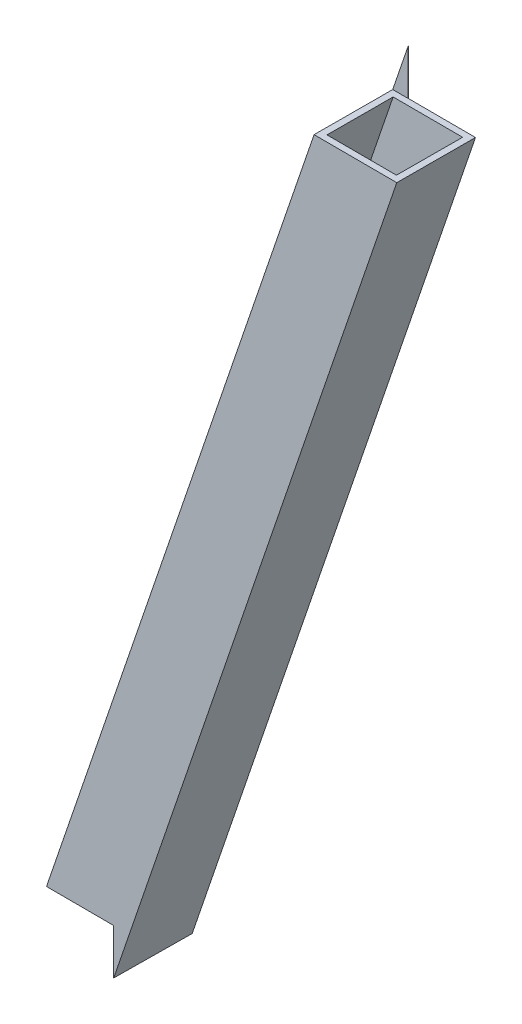
ISO-10303-21;
HEADER;
FILE_DESCRIPTION(('STEP AP214'),'2;1');
FILE_NAME('part.step','',(''),(''),'','','');
FILE_SCHEMA(('AUTOMOTIVE_DESIGN { 1 0 10303 214 1 1 1 1 }'));
ENDSEC;
DATA;
#1=APPLICATION_CONTEXT('core data for automotive mechanical design processes');
#2=APPLICATION_PROTOCOL_DEFINITION('international standard','automotive_design',2000,#1);
#3=PRODUCT_CONTEXT('',#1,'mechanical');
#4=PRODUCT('Part','Part','',(#3));
#5=PRODUCT_RELATED_PRODUCT_CATEGORY('part','',(#4));
#6=PRODUCT_DEFINITION_FORMATION('','',#4);
#7=PRODUCT_DEFINITION_CONTEXT('part definition',#1,'design');
#8=PRODUCT_DEFINITION('design','',#6,#7);
#9=PRODUCT_DEFINITION_SHAPE('','',#8);
#10=(LENGTH_UNIT() NAMED_UNIT(*) SI_UNIT(.MILLI.,.METRE.));
#11=(NAMED_UNIT(*) PLANE_ANGLE_UNIT() SI_UNIT($,.RADIAN.));
#12=(NAMED_UNIT(*) SI_UNIT($,.STERADIAN.) SOLID_ANGLE_UNIT());
#13=UNCERTAINTY_MEASURE_WITH_UNIT(LENGTH_MEASURE(1.E-05),#10,'distance_accuracy_value','');
#14=(GEOMETRIC_REPRESENTATION_CONTEXT(3) GLOBAL_UNCERTAINTY_ASSIGNED_CONTEXT((#13)) GLOBAL_UNIT_ASSIGNED_CONTEXT((#10,
#11,#12)) REPRESENTATION_CONTEXT('',''));
#15=CARTESIAN_POINT('',(0.,0.,0.));
#16=DIRECTION('',(0.,0.,1.));
#17=DIRECTION('',(1.,0.,0.));
#18=AXIS2_PLACEMENT_3D('',#15,#16,#17);
#19=CARTESIAN_POINT('',(259.494014953427,216.76340399315,-2309.96935937523));
#20=DIRECTION('',(-0.946505758584915,0.322672417699403,-0.00305938255490225));
#21=DIRECTION('',(-0.322673927788139,-0.94651018817854,0.));
#22=AXIS2_PLACEMENT_3D('',#19,#20,#21);
#23=PLANE('',#22);
#24=DIRECTION('',(0.,0.00948096236965107,0.999955054666231));
#25=VECTOR('',#24,1.);
#26=CARTESIAN_POINT('',(185.,-1.73273111590877,-2307.8977126295));
#27=LINE('',#26,#25);
#28=CARTESIAN_POINT('',(185.,-1.75237320356851,-2309.96935937523));
#29=VERTEX_POINT('',#28);
#30=CARTESIAN_POINT('',(185.,-1.5627463207353,-2289.96945297367));
#31=VERTEX_POINT('',#30);
#32=EDGE_CURVE('E51',#29,#31,#27,.T.);
#33=ORIENTED_EDGE('',*,*,#32,.F.);
#34=DIRECTION('',(-0.322673927788139,-0.94651018817854,0.));
#35=VECTOR('',#34,1.);
#36=CARTESIAN_POINT('',(259.494014953427,216.76340399315,-2309.96935937523));
#37=LINE('',#36,#35);
#38=CARTESIAN_POINT('',(257.188309046744,210.,-2309.96935937523));
#39=VERTEX_POINT('',#38);
#40=EDGE_CURVE('E186',#39,#29,#37,.T.);
#41=ORIENTED_EDGE('',*,*,#40,.F.);
#42=DIRECTION('',(0.00323227465391518,0.,-0.999994776186637));
#43=VECTOR('',#42,1.);
#44=CARTESIAN_POINT('',(257.188333135763,210.,-2309.97681201106));
#45=LINE('',#44,#43);
#46=CARTESIAN_POINT('',(257.123663518432,210.,-2289.96945297367));
#47=VERTEX_POINT('',#46);
#48=EDGE_CURVE('E183',#47,#39,#45,.T.);
#49=ORIENTED_EDGE('',*,*,#48,.F.);
#50=DIRECTION('',(-0.322673927788139,-0.94651018817854,0.));
#51=VECTOR('',#50,1.);
#52=CARTESIAN_POINT('',(259.436100218272,216.783147652862,-2289.96945297367));
#53=LINE('',#52,#51);
#54=EDGE_CURVE('E45',#47,#31,#53,.T.);
#55=ORIENTED_EDGE('',*,*,#54,.T.);
#56=EDGE_LOOP('',(#33,#41,#49,#55));
#57=FACE_BOUND('',#56,.T.);
#58=ADVANCED_FACE('F41',(#57),#23,.F.);
#59=CARTESIAN_POINT('',(259.436100218272,216.783147652862,-2289.96945297367));
#60=DIRECTION('',(0.00289573675774193,-0.000987182985593841,-0.999995320078241));
#61=DIRECTION('',(-0.99999580734144,0.,-0.00289573816873449));
#62=AXIS2_PLACEMENT_3D('',#59,#60,#61);
#63=PLANE('',#62);
#64=DIRECTION('',(0.,0.999999512730672,-0.000987187124528355));
#65=VECTOR('',#64,1.);
#66=CARTESIAN_POINT('',(185.,216.7829348664,-2290.18500112386));
#67=LINE('',#66,#65);
#68=CARTESIAN_POINT('',(185.,10.,-2289.98086757352));
#69=VERTEX_POINT('',#68);
#70=EDGE_CURVE('E11',#31,#69,#67,.T.);
#71=ORIENTED_EDGE('',*,*,#70,.F.);
#72=ORIENTED_EDGE('',*,*,#54,.F.);
#73=DIRECTION('',(0.99999580734144,0.,0.00289573816873449));
#74=VECTOR('',#73,1.);
#75=CARTESIAN_POINT('',(259.436080827797,210.,-2289.96275679053));
#76=LINE('',#75,#74);
#77=CARTESIAN_POINT('',(235.993509135147,210.,-2290.03064062477));
#78=VERTEX_POINT('',#77);
#79=EDGE_CURVE('E125',#78,#47,#76,.T.);
#80=ORIENTED_EDGE('',*,*,#79,.F.);
#81=DIRECTION('',(-0.322673927788139,-0.94651018817854,0.));
#82=VECTOR('',#81,1.);
#83=CARTESIAN_POINT('',(240.505985046573,223.23659600685,-2290.03064062477));
#84=LINE('',#83,#82);
#85=CARTESIAN_POINT('',(167.811690953239,10.,-2290.03064062477));
#86=VERTEX_POINT('',#85);
#87=EDGE_CURVE('E184',#78,#86,#84,.T.);
#88=ORIENTED_EDGE('',*,*,#87,.T.);
#89=DIRECTION('',(-0.99999580734144,0.,-0.00289573816873449));
#90=VECTOR('',#89,1.);
#91=CARTESIAN_POINT('',(259.435509102829,10.,-2289.76532092499));
#92=LINE('',#91,#90);
#93=EDGE_CURVE('E200',#69,#86,#92,.T.);
#94=ORIENTED_EDGE('',*,*,#93,.F.);
#95=EDGE_LOOP('',(#71,#72,#80,#88,#94));
#96=FACE_BOUND('',#95,.T.);
#97=ADVANCED_FACE('F220',(#96),#63,.F.);
#98=CARTESIAN_POINT('',(259.494014953427,216.76340399315,-2309.96935937523));
#99=DIRECTION('',(-0.00289573675774193,0.000987182985593842,0.99999532007824));
#100=DIRECTION('',(0.99999580734144,0.,0.00289573816873449));
#101=AXIS2_PLACEMENT_3D('',#98,#99,#100);
#102=PLANE('',#101);
#103=DIRECTION('',(0.,-0.999999512730672,0.000987187124528357));
#104=VECTOR('',#103,1.);
#105=CARTESIAN_POINT('',(185.,216.76319104113,-2310.18507523188));
#106=LINE('',#105,#104);
#107=CARTESIAN_POINT('',(185.,10.,-2309.9809611724));
#108=VERTEX_POINT('',#107);
#109=EDGE_CURVE('E82',#108,#29,#106,.T.);
#110=ORIENTED_EDGE('',*,*,#109,.F.);
#111=DIRECTION('',(0.99999580734144,0.,0.00289573816873449));
#112=VECTOR('',#111,1.);
#113=CARTESIAN_POINT('',(259.493423894423,10.,-2309.76524681709));
#114=LINE('',#113,#112);
#115=CARTESIAN_POINT('',(167.876336481568,10.,-2310.03054702633));
#116=VERTEX_POINT('',#115);
#117=EDGE_CURVE('E207',#116,#108,#114,.T.);
#118=ORIENTED_EDGE('',*,*,#117,.F.);
#119=DIRECTION('',(-0.322673927788139,-0.94651018817854,0.));
#120=VECTOR('',#119,1.);
#121=CARTESIAN_POINT('',(240.563899781728,223.216852347138,-2310.03054702633));
#122=LINE('',#121,#120);
#123=CARTESIAN_POINT('',(240.,221.562746320735,-2310.03054702633));
#124=VERTEX_POINT('',#123);
#125=EDGE_CURVE('E168',#124,#116,#122,.T.);
#126=ORIENTED_EDGE('',*,*,#125,.F.);
#127=DIRECTION('',(0.,0.999999512730672,-0.000987187124528357));
#128=VECTOR('',#127,1.);
#129=CARTESIAN_POINT('',(240.,216.763348266662,-2310.02580912006));
#130=LINE('',#129,#128);
#131=CARTESIAN_POINT('',(240.,210.,-2310.01913242648));
#132=VERTEX_POINT('',#131);
#133=EDGE_CURVE('E201',#132,#124,#130,.T.);
#134=ORIENTED_EDGE('',*,*,#133,.F.);
#135=DIRECTION('',(-0.99999580734144,0.,-0.00289573816873449));
#136=VECTOR('',#135,1.);
#137=CARTESIAN_POINT('',(259.493995619392,210.,-2309.96268268263));
#138=LINE('',#137,#136);
#139=EDGE_CURVE('E137',#39,#132,#138,.T.);
#140=ORIENTED_EDGE('',*,*,#139,.F.);
#141=ORIENTED_EDGE('',*,*,#40,.T.);
#142=EDGE_LOOP('',(#110,#118,#126,#134,#140,#141));
#143=FACE_BOUND('',#142,.T.);
#144=ADVANCED_FACE('F212',(#143),#102,.F.);
#145=CARTESIAN_POINT('',(257.974972560878,217.281259354246,-2308.3742618752));
#146=DIRECTION('',(-0.946505758584915,0.322672417699403,-0.0030593825549024));
#147=DIRECTION('',(-0.322673927788139,-0.94651018817854,0.));
#148=AXIS2_PLACEMENT_3D('',#145,#146,#147);
#149=PLANE('',#148);
#150=DIRECTION('',(-0.322673927788139,-0.94651018817854,0.));
#151=VECTOR('',#150,1.);
#152=CARTESIAN_POINT('',(257.974972560878,217.281259354246,-2308.3742618752));
#153=LINE('',#152,#151);
#154=CARTESIAN_POINT('',(255.492725053749,210.,-2308.3742618752));
#155=VERTEX_POINT('',#154);
#156=CARTESIAN_POINT('',(185.,3.22133984233567,-2308.3742618752));
#157=VERTEX_POINT('',#156);
#158=EDGE_CURVE('E194',#155,#157,#153,.T.);
#159=ORIENTED_EDGE('',*,*,#158,.T.);
#160=DIRECTION('',(0.,0.00948096236965153,0.999955054666231));
#161=VECTOR('',#160,1.);
#162=CARTESIAN_POINT('',(185.,3.24058139897487,-2306.34485904974));
#163=LINE('',#162,#161);
#164=CARTESIAN_POINT('',(185.,3.3806264239157,-2291.57434049788));
#165=VERTEX_POINT('',#164);
#166=EDGE_CURVE('E191',#157,#165,#163,.T.);
#167=ORIENTED_EDGE('',*,*,#166,.T.);
#168=DIRECTION('',(-0.322673927788139,-0.94651018817854,0.));
#169=VECTOR('',#168,1.);
#170=CARTESIAN_POINT('',(257.926324183348,217.297844028404,-2291.57434049788));
#171=LINE('',#170,#169);
#172=CARTESIAN_POINT('',(255.438422810031,210.,-2291.57434049788));
#173=VERTEX_POINT('',#172);
#174=EDGE_CURVE('E197',#173,#165,#171,.T.);
#175=ORIENTED_EDGE('',*,*,#174,.F.);
#176=DIRECTION('',(0.00323227465391534,0.,-0.999994776186637));
#177=VECTOR('',#176,1.);
#178=CARTESIAN_POINT('',(255.492750987277,210.,-2308.38228513899));
#179=LINE('',#178,#177);
#180=EDGE_CURVE('E154',#173,#155,#179,.T.);
#181=ORIENTED_EDGE('',*,*,#180,.T.);
#182=EDGE_LOOP('',(#159,#167,#175,#181));
#183=FACE_BOUND('',#182,.T.);
#184=ADVANCED_FACE('F227',(#183),#149,.T.);
#185=CARTESIAN_POINT('',(257.926324183348,217.297844028404,-2291.57434049788));
#186=DIRECTION('',(0.00289573675775995,-0.000987182985599982,-0.99999532007824));
#187=DIRECTION('',(-0.99999580734144,0.,-0.00289573816875251));
#188=AXIS2_PLACEMENT_3D('',#185,#186,#187);
#189=PLANE('',#188);
#190=ORIENTED_EDGE('',*,*,#174,.T.);
#191=DIRECTION('',(0.,0.999999512730672,-0.000987187124534497));
#192=VECTOR('',#191,1.);
#193=CARTESIAN_POINT('',(185.,217.297635557857,-2291.78551671792));
#194=LINE('',#193,#192);
#195=CARTESIAN_POINT('',(185.,10.,-2291.58087506143));
#196=VERTEX_POINT('',#195);
#197=EDGE_CURVE('E195',#165,#196,#194,.T.);
#198=ORIENTED_EDGE('',*,*,#197,.T.);
#199=DIRECTION('',(-0.99999580734144,0.,-0.00289573816875251));
#200=VECTOR('',#199,1.);
#201=CARTESIAN_POINT('',(257.925731596581,10.,-2291.36970035158));
#202=LINE('',#201,#200);
#203=CARTESIAN_POINT('',(169.507274946216,10.,-2291.6257381248));
#204=VERTEX_POINT('',#203);
#205=EDGE_CURVE('E160',#196,#204,#202,.T.);
#206=ORIENTED_EDGE('',*,*,#205,.T.);
#207=DIRECTION('',(-0.322673927788139,-0.94651018817854,0.));
#208=VECTOR('',#207,1.);
#209=CARTESIAN_POINT('',(242.025027439122,222.718740645754,-2291.6257381248));
#210=LINE('',#209,#208);
#211=CARTESIAN_POINT('',(237.689093128069,210.,-2291.6257381248));
#212=VERTEX_POINT('',#211);
#213=EDGE_CURVE('E165',#212,#204,#210,.T.);
#214=ORIENTED_EDGE('',*,*,#213,.F.);
#215=DIRECTION('',(0.99999580734144,0.,0.00289573816875251));
#216=VECTOR('',#215,1.);
#217=CARTESIAN_POINT('',(257.92630332155,210.,-2291.56713621712));
#218=LINE('',#217,#216);
#219=EDGE_CURVE('E148',#212,#173,#218,.T.);
#220=ORIENTED_EDGE('',*,*,#219,.T.);
#221=EDGE_LOOP('',(#190,#198,#206,#214,#220));
#222=FACE_BOUND('',#221,.T.);
#223=ADVANCED_FACE('F171',(#222),#189,.T.);
#224=CARTESIAN_POINT('',(257.974972560878,217.281259354246,-2308.3742618752));
#225=DIRECTION('',(-0.00289573675775995,0.000987182985599982,0.99999532007824));
#226=DIRECTION('',(0.99999580734144,0.,0.00289573816875251));
#227=AXIS2_PLACEMENT_3D('',#224,#225,#226);
#228=PLANE('',#227);
#229=DIRECTION('',(0.99999580734144,0.,0.00289573816875251));
#230=VECTOR('',#229,1.);
#231=CARTESIAN_POINT('',(257.974380021521,10.,-2308.16963810094));
#232=LINE('',#231,#230);
#233=CARTESIAN_POINT('',(169.561577189971,10.,-2308.42565950212));
#234=VERTEX_POINT('',#233);
#235=CARTESIAN_POINT('',(185.,10.,-2308.38095368449));
#236=VERTEX_POINT('',#235);
#237=EDGE_CURVE('E159',#234,#236,#232,.T.);
#238=ORIENTED_EDGE('',*,*,#237,.T.);
#239=DIRECTION('',(0.,-0.999999512730672,0.000987187124534497));
#240=VECTOR('',#239,1.);
#241=CARTESIAN_POINT('',(185.,217.28105074463,-2308.58557896865));
#242=LINE('',#241,#240);
#243=EDGE_CURVE('E187',#236,#157,#242,.T.);
#244=ORIENTED_EDGE('',*,*,#243,.T.);
#245=ORIENTED_EDGE('',*,*,#158,.F.);
#246=DIRECTION('',(-0.99999580734144,0.,-0.00289573816875251));
#247=VECTOR('',#246,1.);
#248=CARTESIAN_POINT('',(257.97495174649,210.,-2308.36707396648));
#249=LINE('',#248,#247);
#250=CARTESIAN_POINT('',(237.74339537179,210.,-2308.42565950212));
#251=VERTEX_POINT('',#250);
#252=EDGE_CURVE('E190',#155,#251,#249,.T.);
#253=ORIENTED_EDGE('',*,*,#252,.T.);
#254=DIRECTION('',(-0.322673927788139,-0.94651018817854,0.));
#255=VECTOR('',#254,1.);
#256=CARTESIAN_POINT('',(242.073675816652,222.702155971596,-2308.42565950212));
#257=LINE('',#256,#255);
#258=EDGE_CURVE('E167',#251,#234,#257,.T.);
#259=ORIENTED_EDGE('',*,*,#258,.T.);
#260=EDGE_LOOP('',(#238,#244,#245,#253,#259));
#261=FACE_BOUND('',#260,.T.);
#262=ADVANCED_FACE('F231',(#261),#228,.T.);
#263=CARTESIAN_POINT('',(250.,210.,-2310.));
#264=DIRECTION('',(0.,1.,0.));
#265=DIRECTION('',(0.,0.,1.));
#266=AXIS2_PLACEMENT_3D('',#263,#264,#265);
#267=PLANE('',#266);
#268=ORIENTED_EDGE('',*,*,#139,.T.);
#269=DIRECTION('',(0.,0.,-1.));
#270=VECTOR('',#269,1.);
#271=CARTESIAN_POINT('',(240.,210.,-2000.));
#272=LINE('',#271,#270);
#273=CARTESIAN_POINT('',(240.,210.,-2310.));
#274=VERTEX_POINT('',#273);
#275=EDGE_CURVE('E134',#274,#132,#272,.T.);
#276=ORIENTED_EDGE('',*,*,#275,.F.);
#277=DIRECTION('',(-1.,0.,0.));
#278=VECTOR('',#277,1.);
#279=CARTESIAN_POINT('',(250.,210.,-2310.));
#280=LINE('',#279,#278);
#281=CARTESIAN_POINT('',(236.058055926491,210.,-2310.));
#282=VERTEX_POINT('',#281);
#283=EDGE_CURVE('E249',#274,#282,#280,.T.);
#284=ORIENTED_EDGE('',*,*,#283,.T.);
#285=DIRECTION('',(-0.00323227465391656,0.,0.999994776186637));
#286=VECTOR('',#285,1.);
#287=CARTESIAN_POINT('',(236.058201737606,210.,-2310.045110756));
#288=LINE('',#287,#286);
#289=EDGE_CURVE('E130',#282,#78,#288,.T.);
#290=ORIENTED_EDGE('',*,*,#289,.T.);
#291=ORIENTED_EDGE('',*,*,#79,.T.);
#292=ORIENTED_EDGE('',*,*,#48,.T.);
#293=EDGE_LOOP('',(#268,#276,#284,#290,#291,#292));
#294=FACE_BOUND('',#293,.T.);
#295=DIRECTION('',(-0.00323227465391534,0.,0.999994776186637));
#296=VECTOR('',#295,1.);
#297=CARTESIAN_POINT('',(237.743440612825,210.,-2308.43965608473));
#298=LINE('',#297,#296);
#299=EDGE_CURVE('E151',#251,#212,#298,.T.);
#300=ORIENTED_EDGE('',*,*,#299,.F.);
#301=ORIENTED_EDGE('',*,*,#252,.F.);
#302=ORIENTED_EDGE('',*,*,#180,.F.);
#303=ORIENTED_EDGE('',*,*,#219,.F.);
#304=EDGE_LOOP('',(#300,#301,#302,#303));
#305=FACE_BOUND('',#304,.T.);
#306=ADVANCED_FACE('F150',(#294,#305),#267,.T.);
#307=CARTESIAN_POINT('',(240.563899781728,223.216852347138,-2310.03054702633));
#308=DIRECTION('',(0.946505758584915,-0.322672417699403,0.00305938255490356));
#309=DIRECTION('',(0.322673927788139,0.94651018817854,0.));
#310=AXIS2_PLACEMENT_3D('',#307,#308,#309);
#311=PLANE('',#310);
#312=ORIENTED_EDGE('',*,*,#289,.F.);
#313=DIRECTION('',(-0.322673927788139,-0.94651018817854,0.));
#314=VECTOR('',#313,1.);
#315=CARTESIAN_POINT('',(240.563811325167,223.216882502784,-2310.));
#316=LINE('',#315,#314);
#317=CARTESIAN_POINT('',(240.,221.563035948959,-2310.));
#318=VERTEX_POINT('',#317);
#319=EDGE_CURVE('E205',#318,#282,#316,.T.);
#320=ORIENTED_EDGE('',*,*,#319,.F.);
#321=DIRECTION('',(0.,0.00948096236965457,0.999955054666231));
#322=VECTOR('',#321,1.);
#323=CARTESIAN_POINT('',(240.,221.562895006088,-2310.0148652142));
#324=LINE('',#323,#322);
#325=EDGE_CURVE('E176',#124,#318,#324,.T.);
#326=ORIENTED_EDGE('',*,*,#325,.F.);
#327=ORIENTED_EDGE('',*,*,#125,.T.);
#328=DIRECTION('',(0.00323227465391656,0.,-0.999994776186637));
#329=VECTOR('',#328,1.);
#330=CARTESIAN_POINT('',(167.877095892113,10.,-2310.26549196753));
#331=LINE('',#330,#329);
#332=EDGE_CURVE('E234',#86,#116,#331,.T.);
#333=ORIENTED_EDGE('',*,*,#332,.F.);
#334=ORIENTED_EDGE('',*,*,#87,.F.);
#335=EDGE_LOOP('',(#312,#320,#326,#327,#333,#334));
#336=FACE_BOUND('',#335,.T.);
#337=ADVANCED_FACE('F240',(#336),#311,.F.);
#338=CARTESIAN_POINT('',(242.073675816652,222.702155971596,-2308.42565950212));
#339=DIRECTION('',(0.946505758584915,-0.322672417699403,0.0030593825549024));
#340=DIRECTION('',(0.322673927788139,0.94651018817854,0.));
#341=AXIS2_PLACEMENT_3D('',#338,#339,#340);
#342=PLANE('',#341);
#343=ORIENTED_EDGE('',*,*,#258,.F.);
#344=ORIENTED_EDGE('',*,*,#299,.T.);
#345=ORIENTED_EDGE('',*,*,#213,.T.);
#346=DIRECTION('',(0.00323227465391534,0.,-0.999994776186637));
#347=VECTOR('',#346,1.);
#348=CARTESIAN_POINT('',(169.562334767332,10.,-2308.66003729626));
#349=LINE('',#348,#347);
#350=EDGE_CURVE('E174',#204,#234,#349,.T.);
#351=ORIENTED_EDGE('',*,*,#350,.T.);
#352=EDGE_LOOP('',(#343,#344,#345,#351));
#353=FACE_BOUND('',#352,.T.);
#354=ADVANCED_FACE('F163',(#353),#342,.T.);
#355=CARTESIAN_POINT('',(240.,210.,-2000.));
#356=DIRECTION('',(1.,0.,0.));
#357=DIRECTION('',(0.,0.,-1.));
#358=AXIS2_PLACEMENT_3D('',#355,#356,#357);
#359=PLANE('',#358);
#360=ORIENTED_EDGE('',*,*,#325,.T.);
#361=DIRECTION('',(0.,-1.,0.));
#362=VECTOR('',#361,1.);
#363=CARTESIAN_POINT('',(240.,210.,-2310.));
#364=LINE('',#363,#362);
#365=EDGE_CURVE('E91',#318,#274,#364,.T.);
#366=ORIENTED_EDGE('',*,*,#365,.T.);
#367=ORIENTED_EDGE('',*,*,#275,.T.);
#368=ORIENTED_EDGE('',*,*,#133,.T.);
#369=EDGE_LOOP('',(#360,#366,#367,#368));
#370=FACE_BOUND('',#369,.T.);
#371=ADVANCED_FACE('F245',(#370),#359,.T.);
#372=CARTESIAN_POINT('',(165.,10.,-2300.));
#373=DIRECTION('',(0.,-1.,0.));
#374=DIRECTION('',(0.,0.,-1.));
#375=AXIS2_PLACEMENT_3D('',#372,#373,#374);
#376=PLANE('',#375);
#377=ORIENTED_EDGE('',*,*,#350,.F.);
#378=ORIENTED_EDGE('',*,*,#205,.F.);
#379=DIRECTION('',(0.,0.,1.));
#380=VECTOR('',#379,1.);
#381=CARTESIAN_POINT('',(185.,10.,-2300.));
#382=LINE('',#381,#380);
#383=EDGE_CURVE('E198',#196,#69,#382,.T.);
#384=ORIENTED_EDGE('',*,*,#383,.T.);
#385=ORIENTED_EDGE('',*,*,#93,.T.);
#386=ORIENTED_EDGE('',*,*,#332,.T.);
#387=ORIENTED_EDGE('',*,*,#117,.T.);
#388=DIRECTION('',(0.,0.,1.));
#389=VECTOR('',#388,1.);
#390=CARTESIAN_POINT('',(185.,10.,-2300.));
#391=LINE('',#390,#389);
#392=EDGE_CURVE('E60',#108,#236,#391,.T.);
#393=ORIENTED_EDGE('',*,*,#392,.T.);
#394=ORIENTED_EDGE('',*,*,#237,.F.);
#395=EDGE_LOOP('',(#377,#378,#384,#385,#386,#387,#393,#394));
#396=FACE_BOUND('',#395,.T.);
#397=ADVANCED_FACE('F223',(#396),#376,.T.);
#398=CARTESIAN_POINT('',(250.,210.,-2310.));
#399=DIRECTION('',(0.,0.,1.));
#400=DIRECTION('',(1.,0.,0.));
#401=AXIS2_PLACEMENT_3D('',#398,#399,#400);
#402=PLANE('',#401);
#403=ORIENTED_EDGE('',*,*,#319,.T.);
#404=ORIENTED_EDGE('',*,*,#283,.F.);
#405=ORIENTED_EDGE('',*,*,#365,.F.);
#406=EDGE_LOOP('',(#403,#404,#405));
#407=FACE_BOUND('',#406,.T.);
#408=ADVANCED_FACE('F258',(#407),#402,.T.);
#409=CARTESIAN_POINT('',(185.,-10.,-2300.));
#410=DIRECTION('',(-1.,0.,0.));
#411=DIRECTION('',(0.,0.,1.));
#412=AXIS2_PLACEMENT_3D('',#409,#410,#411);
#413=PLANE('',#412);
#414=ORIENTED_EDGE('',*,*,#109,.T.);
#415=ORIENTED_EDGE('',*,*,#32,.T.);
#416=ORIENTED_EDGE('',*,*,#70,.T.);
#417=ORIENTED_EDGE('',*,*,#383,.F.);
#418=ORIENTED_EDGE('',*,*,#197,.F.);
#419=ORIENTED_EDGE('',*,*,#166,.F.);
#420=ORIENTED_EDGE('',*,*,#243,.F.);
#421=ORIENTED_EDGE('',*,*,#392,.F.);
#422=EDGE_LOOP('',(#414,#415,#416,#417,#418,#419,#420,#421));
#423=FACE_BOUND('',#422,.T.);
#424=ADVANCED_FACE('F43',(#423),#413,.T.);
#425=CLOSED_SHELL('',(#58,#97,#144,#184,#223,#262,#306,#337,#354,#371,#397,#408,#424));
#426=MANIFOLD_SOLID_BREP('B2',#425);
#427=ADVANCED_BREP_SHAPE_REPRESENTATION('',(#18,#426),#14);
#428=SHAPE_DEFINITION_REPRESENTATION(#9,#427);
ENDSEC;
END-ISO-10303-21;
